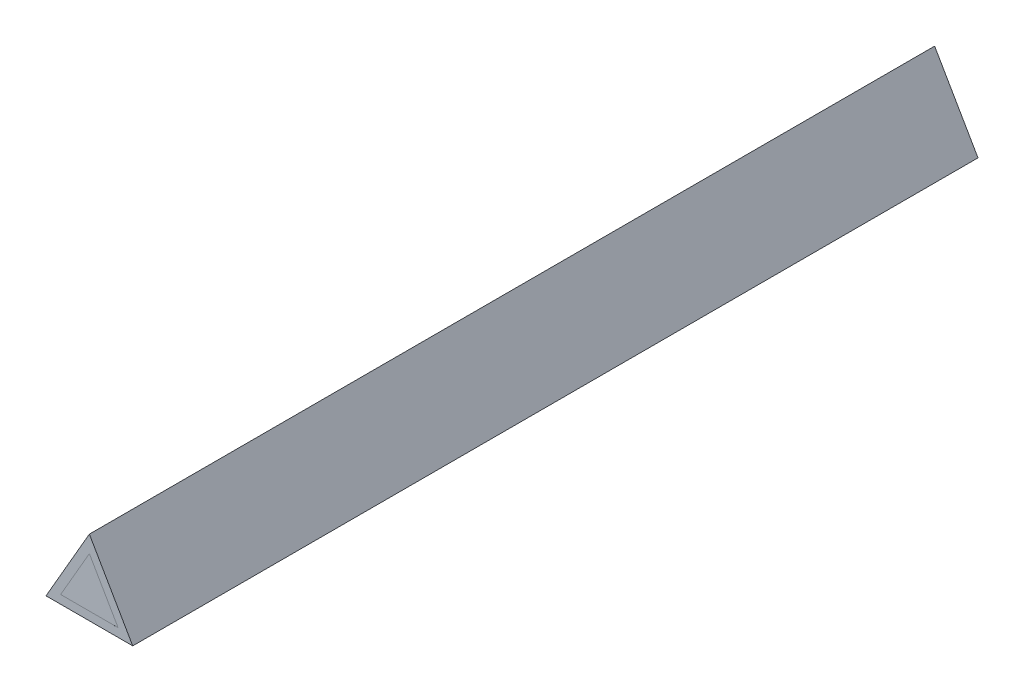
ISO-10303-21;
HEADER;
FILE_DESCRIPTION(('STEP AP214'),'2;1');
FILE_NAME('part.step','',(''),(''),'','','');
FILE_SCHEMA(('AUTOMOTIVE_DESIGN { 1 0 10303 214 1 1 1 1 }'));
ENDSEC;
DATA;
#1=APPLICATION_CONTEXT('core data for automotive mechanical design processes');
#2=APPLICATION_PROTOCOL_DEFINITION('international standard','automotive_design',2000,#1);
#3=PRODUCT_CONTEXT('',#1,'mechanical');
#4=PRODUCT('Part','Part','',(#3));
#5=PRODUCT_RELATED_PRODUCT_CATEGORY('part','',(#4));
#6=PRODUCT_DEFINITION_FORMATION('','',#4);
#7=PRODUCT_DEFINITION_CONTEXT('part definition',#1,'design');
#8=PRODUCT_DEFINITION('design','',#6,#7);
#9=PRODUCT_DEFINITION_SHAPE('','',#8);
#10=(LENGTH_UNIT() NAMED_UNIT(*) SI_UNIT(.MILLI.,.METRE.));
#11=(NAMED_UNIT(*) PLANE_ANGLE_UNIT() SI_UNIT($,.RADIAN.));
#12=(NAMED_UNIT(*) SI_UNIT($,.STERADIAN.) SOLID_ANGLE_UNIT());
#13=UNCERTAINTY_MEASURE_WITH_UNIT(LENGTH_MEASURE(1.E-05),#10,'distance_accuracy_value','');
#14=(GEOMETRIC_REPRESENTATION_CONTEXT(3) GLOBAL_UNCERTAINTY_ASSIGNED_CONTEXT((#13)) GLOBAL_UNIT_ASSIGNED_CONTEXT((#10,
#11,#12)) REPRESENTATION_CONTEXT('',''));
#15=CARTESIAN_POINT('',(0.,0.,0.));
#16=DIRECTION('',(0.,0.,1.));
#17=DIRECTION('',(1.,0.,0.));
#18=AXIS2_PLACEMENT_3D('',#15,#16,#17);
#19=CARTESIAN_POINT('',(0.,0.,500.));
#20=DIRECTION('',(0.,0.,-1.));
#21=DIRECTION('',(-1.,0.,0.));
#22=AXIS2_PLACEMENT_3D('',#19,#20,#21);
#23=PLANE('',#22);
#24=DIRECTION('',(-0.5,-0.866025403784439,0.));
#25=VECTOR('',#24,1.);
#26=CARTESIAN_POINT('',(-25.6507040378444,-15.,500.));
#27=LINE('',#26,#25);
#28=CARTESIAN_POINT('',(0.,29.4283226434586,500.));
#29=VERTEX_POINT('',#28);
#30=CARTESIAN_POINT('',(-25.6507040378444,-15.,500.));
#31=VERTEX_POINT('',#30);
#32=EDGE_CURVE('P0_E121',#29,#31,#27,.T.);
#33=ORIENTED_EDGE('',*,*,#32,.T.);
#34=DIRECTION('',(1.,0.,0.));
#35=VECTOR('',#34,1.);
#36=CARTESIAN_POINT('',(25.6507040378444,-15.,500.));
#37=LINE('',#36,#35);
#38=CARTESIAN_POINT('',(25.6507040378444,-15.,500.));
#39=VERTEX_POINT('',#38);
#40=EDGE_CURVE('P0_E124',#31,#39,#37,.T.);
#41=ORIENTED_EDGE('',*,*,#40,.T.);
#42=DIRECTION('',(-0.5,0.866025403784438,0.));
#43=VECTOR('',#42,1.);
#44=CARTESIAN_POINT('',(0.,29.4283226434586,500.));
#45=LINE('',#44,#43);
#46=EDGE_CURVE('P0_E127',#39,#29,#45,.T.);
#47=ORIENTED_EDGE('',*,*,#46,.T.);
#48=EDGE_LOOP('',(#33,#41,#47));
#49=FACE_BOUND('',#48,.T.);
#50=DIRECTION('',(-0.5,0.866025403784439,0.));
#51=VECTOR('',#50,1.);
#52=CARTESIAN_POINT('',(0.,19.4283226434586,500.));
#53=LINE('',#52,#51);
#54=CARTESIAN_POINT('',(16.99045,-9.99999999999999,500.));
#55=VERTEX_POINT('',#54);
#56=CARTESIAN_POINT('',(0.,19.4283226434586,500.));
#57=VERTEX_POINT('',#56);
#58=EDGE_CURVE('P0_E94',#55,#57,#53,.T.);
#59=ORIENTED_EDGE('',*,*,#58,.F.);
#60=DIRECTION('',(1.,0.,0.));
#61=VECTOR('',#60,1.);
#62=CARTESIAN_POINT('',(16.99045,-9.99999999999999,500.));
#63=LINE('',#62,#61);
#64=CARTESIAN_POINT('',(-16.99045,-10.,500.));
#65=VERTEX_POINT('',#64);
#66=EDGE_CURVE('P0_E111',#65,#55,#63,.T.);
#67=ORIENTED_EDGE('',*,*,#66,.F.);
#68=DIRECTION('',(-0.5,-0.866025403784439,0.));
#69=VECTOR('',#68,1.);
#70=CARTESIAN_POINT('',(-16.99045,-10.,500.));
#71=LINE('',#70,#69);
#72=EDGE_CURVE('P0_E102',#57,#65,#71,.T.);
#73=ORIENTED_EDGE('',*,*,#72,.F.);
#74=EDGE_LOOP('',(#59,#67,#73));
#75=FACE_BOUND('',#74,.T.);
#76=ADVANCED_FACE('P0_F41',(#49,#75),#23,.F.);
#77=CARTESIAN_POINT('',(0.,0.,0.));
#78=DIRECTION('',(0.,0.,-1.));
#79=DIRECTION('',(-1.,0.,0.));
#80=AXIS2_PLACEMENT_3D('',#77,#78,#79);
#81=PLANE('',#80);
#82=DIRECTION('',(-0.5,-0.866025403784439,0.));
#83=VECTOR('',#82,1.);
#84=CARTESIAN_POINT('',(-25.6507040378444,-15.,0.));
#85=LINE('',#84,#83);
#86=CARTESIAN_POINT('',(0.,29.4283226434586,0.));
#87=VERTEX_POINT('',#86);
#88=CARTESIAN_POINT('',(-25.6507040378444,-15.,0.));
#89=VERTEX_POINT('',#88);
#90=EDGE_CURVE('P0_E109',#87,#89,#85,.T.);
#91=ORIENTED_EDGE('',*,*,#90,.F.);
#92=DIRECTION('',(-0.5,0.866025403784438,0.));
#93=VECTOR('',#92,1.);
#94=CARTESIAN_POINT('',(0.,29.4283226434586,0.));
#95=LINE('',#94,#93);
#96=CARTESIAN_POINT('',(25.6507040378444,-15.,0.));
#97=VERTEX_POINT('',#96);
#98=EDGE_CURVE('P0_E125',#97,#87,#95,.T.);
#99=ORIENTED_EDGE('',*,*,#98,.F.);
#100=DIRECTION('',(1.,0.,0.));
#101=VECTOR('',#100,1.);
#102=CARTESIAN_POINT('',(25.6507040378444,-15.,0.));
#103=LINE('',#102,#101);
#104=EDGE_CURVE('P0_E132',#89,#97,#103,.T.);
#105=ORIENTED_EDGE('',*,*,#104,.F.);
#106=EDGE_LOOP('',(#91,#99,#105));
#107=FACE_BOUND('',#106,.T.);
#108=DIRECTION('',(1.,0.,0.));
#109=VECTOR('',#108,1.);
#110=CARTESIAN_POINT('',(16.99045,-9.99999999999999,0.));
#111=LINE('',#110,#109);
#112=CARTESIAN_POINT('',(-16.99045,-10.,0.));
#113=VERTEX_POINT('',#112);
#114=CARTESIAN_POINT('',(16.99045,-9.99999999999999,0.));
#115=VERTEX_POINT('',#114);
#116=EDGE_CURVE('P0_E103',#113,#115,#111,.T.);
#117=ORIENTED_EDGE('',*,*,#116,.T.);
#118=DIRECTION('',(-0.5,0.866025403784439,0.));
#119=VECTOR('',#118,1.);
#120=CARTESIAN_POINT('',(0.,19.4283226434586,0.));
#121=LINE('',#120,#119);
#122=CARTESIAN_POINT('',(0.,19.4283226434586,0.));
#123=VERTEX_POINT('',#122);
#124=EDGE_CURVE('P0_E64',#115,#123,#121,.T.);
#125=ORIENTED_EDGE('',*,*,#124,.T.);
#126=DIRECTION('',(-0.5,-0.866025403784439,0.));
#127=VECTOR('',#126,1.);
#128=CARTESIAN_POINT('',(-16.99045,-10.,0.));
#129=LINE('',#128,#127);
#130=EDGE_CURVE('P0_E108',#123,#113,#129,.T.);
#131=ORIENTED_EDGE('',*,*,#130,.T.);
#132=EDGE_LOOP('',(#117,#125,#131));
#133=FACE_BOUND('',#132,.T.);
#134=ADVANCED_FACE('P0_F146',(#107,#133),#81,.T.);
#135=CARTESIAN_POINT('',(-25.6507040378444,-15.,500.));
#136=DIRECTION('',(0.866025403784439,-0.5,0.));
#137=DIRECTION('',(0.5,0.866025403784439,0.));
#138=AXIS2_PLACEMENT_3D('',#135,#136,#137);
#139=PLANE('',#138);
#140=ORIENTED_EDGE('',*,*,#90,.T.);
#141=DIRECTION('',(0.,0.,-1.));
#142=VECTOR('',#141,1.);
#143=CARTESIAN_POINT('',(-25.6507040378444,-15.,500.));
#144=LINE('',#143,#142);
#145=EDGE_CURVE('P0_E11',#31,#89,#144,.T.);
#146=ORIENTED_EDGE('',*,*,#145,.F.);
#147=ORIENTED_EDGE('',*,*,#32,.F.);
#148=DIRECTION('',(0.,0.,-1.));
#149=VECTOR('',#148,1.);
#150=CARTESIAN_POINT('',(0.,29.4283226434586,500.));
#151=LINE('',#150,#149);
#152=EDGE_CURVE('P0_E129',#29,#87,#151,.T.);
#153=ORIENTED_EDGE('',*,*,#152,.T.);
#154=EDGE_LOOP('',(#140,#146,#147,#153));
#155=FACE_BOUND('',#154,.T.);
#156=ADVANCED_FACE('P0_F43',(#155),#139,.F.);
#157=CARTESIAN_POINT('',(25.6507040378444,-15.,500.));
#158=DIRECTION('',(0.,1.,0.));
#159=DIRECTION('',(-1.,0.,0.));
#160=AXIS2_PLACEMENT_3D('',#157,#158,#159);
#161=PLANE('',#160);
#162=ORIENTED_EDGE('',*,*,#104,.T.);
#163=DIRECTION('',(0.,0.,-1.));
#164=VECTOR('',#163,1.);
#165=CARTESIAN_POINT('',(25.6507040378444,-15.,500.));
#166=LINE('',#165,#164);
#167=EDGE_CURVE('P0_E49',#39,#97,#166,.T.);
#168=ORIENTED_EDGE('',*,*,#167,.F.);
#169=ORIENTED_EDGE('',*,*,#40,.F.);
#170=ORIENTED_EDGE('',*,*,#145,.T.);
#171=EDGE_LOOP('',(#162,#168,#169,#170));
#172=FACE_BOUND('',#171,.T.);
#173=ADVANCED_FACE('P0_F152',(#172),#161,.F.);
#174=CARTESIAN_POINT('',(0.,29.4283226434586,500.));
#175=DIRECTION('',(-0.866025403784438,-0.5,0.));
#176=DIRECTION('',(0.5,-0.866025403784438,0.));
#177=AXIS2_PLACEMENT_3D('',#174,#175,#176);
#178=PLANE('',#177);
#179=ORIENTED_EDGE('',*,*,#98,.T.);
#180=ORIENTED_EDGE('',*,*,#152,.F.);
#181=ORIENTED_EDGE('',*,*,#46,.F.);
#182=ORIENTED_EDGE('',*,*,#167,.T.);
#183=EDGE_LOOP('',(#179,#180,#181,#182));
#184=FACE_BOUND('',#183,.T.);
#185=ADVANCED_FACE('P0_F141',(#184),#178,.F.);
#186=CARTESIAN_POINT('',(0.,19.4283226434586,500.));
#187=DIRECTION('',(-0.866025403784439,-0.5,0.));
#188=DIRECTION('',(0.5,-0.866025403784439,0.));
#189=AXIS2_PLACEMENT_3D('',#186,#187,#188);
#190=PLANE('',#189);
#191=ORIENTED_EDGE('',*,*,#124,.F.);
#192=DIRECTION('',(0.,0.,-1.));
#193=VECTOR('',#192,1.);
#194=CARTESIAN_POINT('',(16.99045,-9.99999999999999,500.));
#195=LINE('',#194,#193);
#196=EDGE_CURVE('P0_E98',#55,#115,#195,.T.);
#197=ORIENTED_EDGE('',*,*,#196,.F.);
#198=ORIENTED_EDGE('',*,*,#58,.T.);
#199=DIRECTION('',(0.,0.,-1.));
#200=VECTOR('',#199,1.);
#201=CARTESIAN_POINT('',(0.,19.4283226434586,500.));
#202=LINE('',#201,#200);
#203=EDGE_CURVE('P0_E97',#57,#123,#202,.T.);
#204=ORIENTED_EDGE('',*,*,#203,.T.);
#205=EDGE_LOOP('',(#191,#197,#198,#204));
#206=FACE_BOUND('',#205,.T.);
#207=ADVANCED_FACE('P0_F96',(#206),#190,.T.);
#208=CARTESIAN_POINT('',(-16.99045,-10.,500.));
#209=DIRECTION('',(0.866025403784439,-0.5,0.));
#210=DIRECTION('',(0.5,0.866025403784439,0.));
#211=AXIS2_PLACEMENT_3D('',#208,#209,#210);
#212=PLANE('',#211);
#213=ORIENTED_EDGE('',*,*,#130,.F.);
#214=ORIENTED_EDGE('',*,*,#203,.F.);
#215=ORIENTED_EDGE('',*,*,#72,.T.);
#216=DIRECTION('',(0.,0.,-1.));
#217=VECTOR('',#216,1.);
#218=CARTESIAN_POINT('',(-16.99045,-10.,500.));
#219=LINE('',#218,#217);
#220=EDGE_CURVE('P0_E56',#65,#113,#219,.T.);
#221=ORIENTED_EDGE('',*,*,#220,.T.);
#222=EDGE_LOOP('',(#213,#214,#215,#221));
#223=FACE_BOUND('',#222,.T.);
#224=ADVANCED_FACE('P0_F106',(#223),#212,.T.);
#225=CARTESIAN_POINT('',(16.99045,-9.99999999999999,500.));
#226=DIRECTION('',(0.,1.,0.));
#227=DIRECTION('',(-1.,0.,0.));
#228=AXIS2_PLACEMENT_3D('',#225,#226,#227);
#229=PLANE('',#228);
#230=ORIENTED_EDGE('',*,*,#116,.F.);
#231=ORIENTED_EDGE('',*,*,#220,.F.);
#232=ORIENTED_EDGE('',*,*,#66,.T.);
#233=ORIENTED_EDGE('',*,*,#196,.T.);
#234=EDGE_LOOP('',(#230,#231,#232,#233));
#235=FACE_BOUND('',#234,.T.);
#236=ADVANCED_FACE('P0_F170',(#235),#229,.T.);
#237=CLOSED_SHELL('',(#76,#134,#156,#173,#185,#207,#224,#236));
#238=MANIFOLD_SOLID_BREP('P0_B2',#237);
#239=CARTESIAN_POINT('',(-17.7690502321636,-10.4495250536308,497.476076545337));
#240=DIRECTION('',(0.,-1.,0.));
#241=DIRECTION('',(1.,0.,0.));
#242=AXIS2_PLACEMENT_3D('',#239,#240,#241);
#243=PLANE('',#242);
#244=DIRECTION('',(1.,0.,0.));
#245=VECTOR('',#244,1.);
#246=CARTESIAN_POINT('',(-17.7690502321636,-10.4495250536308,499.999));
#247=LINE('',#246,#245);
#248=CARTESIAN_POINT('',(-17.7690502321636,-10.4495250536308,499.999));
#249=VERTEX_POINT('',#248);
#250=CARTESIAN_POINT('',(17.7690502321636,-10.4495250536307,499.999));
#251=VERTEX_POINT('',#250);
#252=EDGE_CURVE('P1_E67',#249,#251,#247,.T.);
#253=ORIENTED_EDGE('',*,*,#252,.F.);
#254=DIRECTION('',(0.,0.,1.));
#255=VECTOR('',#254,1.);
#256=CARTESIAN_POINT('',(-17.7690502321636,-10.4495250536308,497.476076545337));
#257=LINE('',#256,#255);
#258=CARTESIAN_POINT('',(-17.7690502321636,-10.4495250536308,497.476076545337));
#259=VERTEX_POINT('',#258);
#260=EDGE_CURVE('P1_E32',#259,#249,#257,.T.);
#261=ORIENTED_EDGE('',*,*,#260,.F.);
#262=DIRECTION('',(1.,0.,0.));
#263=VECTOR('',#262,1.);
#264=CARTESIAN_POINT('',(-17.7690502321636,-10.4495250536308,497.476076545337));
#265=LINE('',#264,#263);
#266=CARTESIAN_POINT('',(17.7690502321636,-10.4495250536307,497.476076545337));
#267=VERTEX_POINT('',#266);
#268=EDGE_CURVE('P1_E59',#259,#267,#265,.T.);
#269=ORIENTED_EDGE('',*,*,#268,.T.);
#270=DIRECTION('',(0.,0.,1.));
#271=VECTOR('',#270,1.);
#272=CARTESIAN_POINT('',(17.7690502321636,-10.4495250536307,497.476076545337));
#273=LINE('',#272,#271);
#274=EDGE_CURVE('P1_E10',#267,#251,#273,.T.);
#275=ORIENTED_EDGE('',*,*,#274,.T.);
#276=EDGE_LOOP('',(#253,#261,#269,#275));
#277=FACE_BOUND('',#276,.T.);
#278=ADVANCED_FACE('P1_F16',(#277),#243,.T.);
#279=CARTESIAN_POINT('',(17.7690502321636,-10.4495250536308,497.476076545337));
#280=DIRECTION('',(0.866025403784439,0.5,0.));
#281=DIRECTION('',(-0.5,0.866025403784439,0.));
#282=AXIS2_PLACEMENT_3D('',#279,#280,#281);
#283=PLANE('',#282);
#284=DIRECTION('',(-0.5,0.866025403784439,0.));
#285=VECTOR('',#284,1.);
#286=CARTESIAN_POINT('',(17.7690502321636,-10.4495250536308,499.999));
#287=LINE('',#286,#285);
#288=CARTESIAN_POINT('',(0.,20.3273727507202,499.999));
#289=VERTEX_POINT('',#288);
#290=EDGE_CURVE('P1_E54',#251,#289,#287,.T.);
#291=ORIENTED_EDGE('',*,*,#290,.F.);
#292=ORIENTED_EDGE('',*,*,#274,.F.);
#293=DIRECTION('',(-0.5,0.866025403784439,0.));
#294=VECTOR('',#293,1.);
#295=CARTESIAN_POINT('',(17.7690502321636,-10.4495250536308,497.476076545337));
#296=LINE('',#295,#294);
#297=CARTESIAN_POINT('',(0.,20.3273727507202,497.476076545337));
#298=VERTEX_POINT('',#297);
#299=EDGE_CURVE('P1_E51',#267,#298,#296,.T.);
#300=ORIENTED_EDGE('',*,*,#299,.T.);
#301=DIRECTION('',(0.,0.,1.));
#302=VECTOR('',#301,1.);
#303=CARTESIAN_POINT('',(0.,20.3273727507202,497.476076545337));
#304=LINE('',#303,#302);
#305=EDGE_CURVE('P1_E24',#298,#289,#304,.T.);
#306=ORIENTED_EDGE('',*,*,#305,.T.);
#307=EDGE_LOOP('',(#291,#292,#300,#306));
#308=FACE_BOUND('',#307,.T.);
#309=ADVANCED_FACE('P1_F50',(#308),#283,.T.);
#310=CARTESIAN_POINT('',(0.,20.3273727507202,497.476076545337));
#311=DIRECTION('',(-0.866025403784438,0.5,0.));
#312=DIRECTION('',(-0.5,-0.866025403784439,0.));
#313=AXIS2_PLACEMENT_3D('',#310,#311,#312);
#314=PLANE('',#313);
#315=DIRECTION('',(-0.5,-0.866025403784439,0.));
#316=VECTOR('',#315,1.);
#317=CARTESIAN_POINT('',(0.,20.3273727507202,499.999));
#318=LINE('',#317,#316);
#319=EDGE_CURVE('P1_E62',#289,#249,#318,.T.);
#320=ORIENTED_EDGE('',*,*,#319,.F.);
#321=ORIENTED_EDGE('',*,*,#305,.F.);
#322=DIRECTION('',(-0.5,-0.866025403784439,0.));
#323=VECTOR('',#322,1.);
#324=CARTESIAN_POINT('',(0.,20.3273727507202,497.476076545337));
#325=LINE('',#324,#323);
#326=EDGE_CURVE('P1_E60',#298,#259,#325,.T.);
#327=ORIENTED_EDGE('',*,*,#326,.T.);
#328=ORIENTED_EDGE('',*,*,#260,.T.);
#329=EDGE_LOOP('',(#320,#321,#327,#328));
#330=FACE_BOUND('',#329,.T.);
#331=ADVANCED_FACE('P1_F72',(#330),#314,.T.);
#332=CARTESIAN_POINT('',(5.28888699526946,10.2677016521616,497.476076545337));
#333=DIRECTION('',(0.,0.,1.));
#334=DIRECTION('',(0.,-1.,0.));
#335=AXIS2_PLACEMENT_3D('',#332,#333,#334);
#336=PLANE('',#335);
#337=ORIENTED_EDGE('',*,*,#268,.F.);
#338=ORIENTED_EDGE('',*,*,#326,.F.);
#339=ORIENTED_EDGE('',*,*,#299,.F.);
#340=EDGE_LOOP('',(#337,#338,#339));
#341=FACE_BOUND('',#340,.T.);
#342=ADVANCED_FACE('P1_F58',(#341),#336,.F.);
#343=CARTESIAN_POINT('',(5.28888699526946,10.2677016521616,499.999));
#344=DIRECTION('',(0.,0.,1.));
#345=DIRECTION('',(0.,-1.,0.));
#346=AXIS2_PLACEMENT_3D('',#343,#344,#345);
#347=PLANE('',#346);
#348=ORIENTED_EDGE('',*,*,#252,.T.);
#349=ORIENTED_EDGE('',*,*,#290,.T.);
#350=ORIENTED_EDGE('',*,*,#319,.T.);
#351=EDGE_LOOP('',(#348,#349,#350));
#352=FACE_BOUND('',#351,.T.);
#353=ADVANCED_FACE('P1_F71',(#352),#347,.T.);
#354=CLOSED_SHELL('',(#278,#309,#331,#342,#353));
#355=MANIFOLD_SOLID_BREP('P1_B1',#354);
#356=CARTESIAN_POINT('',(17.7690502321636,-10.4495250536308,2.52392345466256));
#357=DIRECTION('',(0.,-1.,0.));
#358=DIRECTION('',(1.,0.,0.));
#359=AXIS2_PLACEMENT_3D('',#356,#357,#358);
#360=PLANE('',#359);
#361=DIRECTION('',(-1.,0.,0.));
#362=VECTOR('',#361,1.);
#363=CARTESIAN_POINT('',(17.7690502321636,-10.4495250536308,0.001));
#364=LINE('',#363,#362);
#365=CARTESIAN_POINT('',(17.7690502321636,-10.4495250536308,0.001));
#366=VERTEX_POINT('',#365);
#367=CARTESIAN_POINT('',(-17.7690502321636,-10.4495250536308,0.001));
#368=VERTEX_POINT('',#367);
#369=EDGE_CURVE('P2_E68',#366,#368,#364,.T.);
#370=ORIENTED_EDGE('',*,*,#369,.F.);
#371=DIRECTION('',(0.,0.,-1.));
#372=VECTOR('',#371,1.);
#373=CARTESIAN_POINT('',(17.7690502321636,-10.4495250536308,2.52392345466256));
#374=LINE('',#373,#372);
#375=CARTESIAN_POINT('',(17.7690502321636,-10.4495250536308,2.52392345466256));
#376=VERTEX_POINT('',#375);
#377=EDGE_CURVE('P2_E33',#376,#366,#374,.T.);
#378=ORIENTED_EDGE('',*,*,#377,.F.);
#379=DIRECTION('',(-1.,0.,0.));
#380=VECTOR('',#379,1.);
#381=CARTESIAN_POINT('',(17.7690502321636,-10.4495250536308,2.52392345466256));
#382=LINE('',#381,#380);
#383=CARTESIAN_POINT('',(-17.7690502321636,-10.4495250536308,2.52392345466256));
#384=VERTEX_POINT('',#383);
#385=EDGE_CURVE('P2_E60',#376,#384,#382,.T.);
#386=ORIENTED_EDGE('',*,*,#385,.T.);
#387=DIRECTION('',(0.,0.,-1.));
#388=VECTOR('',#387,1.);
#389=CARTESIAN_POINT('',(-17.7690502321636,-10.4495250536308,2.52392345466256));
#390=LINE('',#389,#388);
#391=EDGE_CURVE('P2_E11',#384,#368,#390,.T.);
#392=ORIENTED_EDGE('',*,*,#391,.T.);
#393=EDGE_LOOP('',(#370,#378,#386,#392));
#394=FACE_BOUND('',#393,.T.);
#395=ADVANCED_FACE('P2_F17',(#394),#360,.T.);
#396=CARTESIAN_POINT('',(-17.7690502321636,-10.4495250536308,2.52392345466256));
#397=DIRECTION('',(-0.866025403784438,0.5,0.));
#398=DIRECTION('',(-0.5,-0.866025403784439,0.));
#399=AXIS2_PLACEMENT_3D('',#396,#397,#398);
#400=PLANE('',#399);
#401=DIRECTION('',(0.5,0.866025403784439,0.));
#402=VECTOR('',#401,1.);
#403=CARTESIAN_POINT('',(-17.7690502321636,-10.4495250536308,0.001));
#404=LINE('',#403,#402);
#405=CARTESIAN_POINT('',(0.,20.3273727507202,0.001));
#406=VERTEX_POINT('',#405);
#407=EDGE_CURVE('P2_E55',#368,#406,#404,.T.);
#408=ORIENTED_EDGE('',*,*,#407,.F.);
#409=ORIENTED_EDGE('',*,*,#391,.F.);
#410=DIRECTION('',(0.5,0.866025403784439,0.));
#411=VECTOR('',#410,1.);
#412=CARTESIAN_POINT('',(-17.7690502321636,-10.4495250536308,2.52392345466256));
#413=LINE('',#412,#411);
#414=CARTESIAN_POINT('',(0.,20.3273727507202,2.52392345466256));
#415=VERTEX_POINT('',#414);
#416=EDGE_CURVE('P2_E52',#384,#415,#413,.T.);
#417=ORIENTED_EDGE('',*,*,#416,.T.);
#418=DIRECTION('',(0.,0.,-1.));
#419=VECTOR('',#418,1.);
#420=CARTESIAN_POINT('',(0.,20.3273727507202,2.52392345466256));
#421=LINE('',#420,#419);
#422=EDGE_CURVE('P2_E25',#415,#406,#421,.T.);
#423=ORIENTED_EDGE('',*,*,#422,.T.);
#424=EDGE_LOOP('',(#408,#409,#417,#423));
#425=FACE_BOUND('',#424,.T.);
#426=ADVANCED_FACE('P2_F51',(#425),#400,.T.);
#427=CARTESIAN_POINT('',(0.,20.3273727507202,2.52392345466256));
#428=DIRECTION('',(0.866025403784439,0.5,0.));
#429=DIRECTION('',(-0.5,0.866025403784439,0.));
#430=AXIS2_PLACEMENT_3D('',#427,#428,#429);
#431=PLANE('',#430);
#432=DIRECTION('',(0.5,-0.866025403784439,0.));
#433=VECTOR('',#432,1.);
#434=CARTESIAN_POINT('',(0.,20.3273727507202,0.001));
#435=LINE('',#434,#433);
#436=EDGE_CURVE('P2_E63',#406,#366,#435,.T.);
#437=ORIENTED_EDGE('',*,*,#436,.F.);
#438=ORIENTED_EDGE('',*,*,#422,.F.);
#439=DIRECTION('',(0.5,-0.866025403784439,0.));
#440=VECTOR('',#439,1.);
#441=CARTESIAN_POINT('',(0.,20.3273727507202,2.52392345466256));
#442=LINE('',#441,#440);
#443=EDGE_CURVE('P2_E61',#415,#376,#442,.T.);
#444=ORIENTED_EDGE('',*,*,#443,.T.);
#445=ORIENTED_EDGE('',*,*,#377,.T.);
#446=EDGE_LOOP('',(#437,#438,#444,#445));
#447=FACE_BOUND('',#446,.T.);
#448=ADVANCED_FACE('P2_F73',(#447),#431,.T.);
#449=CARTESIAN_POINT('',(5.28888699526946,10.2677016521616,2.52392345466256));
#450=DIRECTION('',(0.,0.,-1.));
#451=DIRECTION('',(0.,1.,0.));
#452=AXIS2_PLACEMENT_3D('',#449,#450,#451);
#453=PLANE('',#452);
#454=ORIENTED_EDGE('',*,*,#385,.F.);
#455=ORIENTED_EDGE('',*,*,#443,.F.);
#456=ORIENTED_EDGE('',*,*,#416,.F.);
#457=EDGE_LOOP('',(#454,#455,#456));
#458=FACE_BOUND('',#457,.T.);
#459=ADVANCED_FACE('P2_F59',(#458),#453,.F.);
#460=CARTESIAN_POINT('',(5.28888699526946,10.2677016521616,0.001));
#461=DIRECTION('',(0.,0.,-1.));
#462=DIRECTION('',(0.,1.,0.));
#463=AXIS2_PLACEMENT_3D('',#460,#461,#462);
#464=PLANE('',#463);
#465=ORIENTED_EDGE('',*,*,#369,.T.);
#466=ORIENTED_EDGE('',*,*,#407,.T.);
#467=ORIENTED_EDGE('',*,*,#436,.T.);
#468=EDGE_LOOP('',(#465,#466,#467));
#469=FACE_BOUND('',#468,.T.);
#470=ADVANCED_FACE('P2_F72',(#469),#464,.T.);
#471=CLOSED_SHELL('',(#395,#426,#448,#459,#470));
#472=MANIFOLD_SOLID_BREP('P2_B1',#471);
#473=ADVANCED_BREP_SHAPE_REPRESENTATION('',(#18,#238,#355,#472),#14);
#474=SHAPE_DEFINITION_REPRESENTATION(#9,#473);
ENDSEC;
END-ISO-10303-21;
